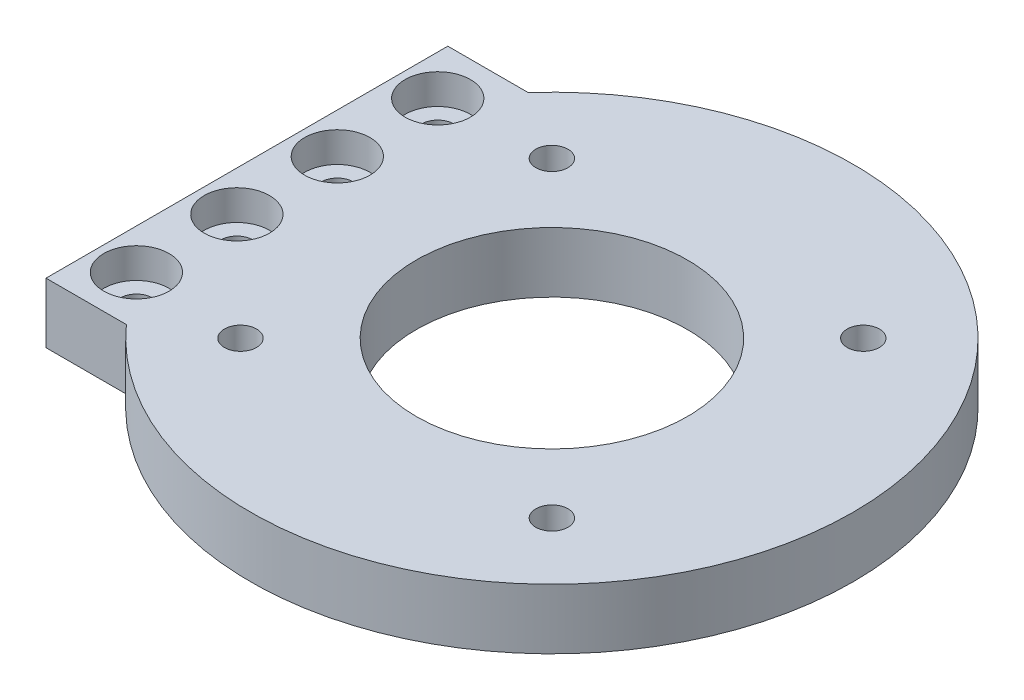
ISO-10303-21;
HEADER;
FILE_DESCRIPTION(('STEP AP214'),'2;1');
FILE_NAME('part.step','',(''),(''),'','','');
FILE_SCHEMA(('AUTOMOTIVE_DESIGN { 1 0 10303 214 1 1 1 1 }'));
ENDSEC;
DATA;
#1=APPLICATION_CONTEXT('core data for automotive mechanical design processes');
#2=APPLICATION_PROTOCOL_DEFINITION('international standard','automotive_design',2000,#1);
#3=PRODUCT_CONTEXT('',#1,'mechanical');
#4=PRODUCT('Part','Part','',(#3));
#5=PRODUCT_RELATED_PRODUCT_CATEGORY('part','',(#4));
#6=PRODUCT_DEFINITION_FORMATION('','',#4);
#7=PRODUCT_DEFINITION_CONTEXT('part definition',#1,'design');
#8=PRODUCT_DEFINITION('design','',#6,#7);
#9=PRODUCT_DEFINITION_SHAPE('','',#8);
#10=(LENGTH_UNIT() NAMED_UNIT(*) SI_UNIT(.MILLI.,.METRE.));
#11=(NAMED_UNIT(*) PLANE_ANGLE_UNIT() SI_UNIT($,.RADIAN.));
#12=(NAMED_UNIT(*) SI_UNIT($,.STERADIAN.) SOLID_ANGLE_UNIT());
#13=UNCERTAINTY_MEASURE_WITH_UNIT(LENGTH_MEASURE(1.E-05),#10,'distance_accuracy_value','');
#14=(GEOMETRIC_REPRESENTATION_CONTEXT(3) GLOBAL_UNCERTAINTY_ASSIGNED_CONTEXT((#13)) GLOBAL_UNIT_ASSIGNED_CONTEXT((#10,
#11,#12)) REPRESENTATION_CONTEXT('',''));
#15=CARTESIAN_POINT('',(0.,0.,0.));
#16=DIRECTION('',(0.,0.,1.));
#17=DIRECTION('',(1.,0.,0.));
#18=AXIS2_PLACEMENT_3D('',#15,#16,#17);
#19=CARTESIAN_POINT('',(-11.3606797749976,0.,-75.));
#20=DIRECTION('',(0.,1.,0.));
#21=DIRECTION('',(0.,0.,1.));
#22=AXIS2_PLACEMENT_3D('',#19,#20,#21);
#23=CYLINDRICAL_SURFACE('',#22,1.6);
#24=CARTESIAN_POINT('',(-11.3606797749976,0.,-75.));
#25=DIRECTION('',(0.,1.,0.));
#26=DIRECTION('',(0.,0.,1.));
#27=AXIS2_PLACEMENT_3D('',#24,#25,#26);
#28=CIRCLE('',#27,1.6);
#29=CARTESIAN_POINT('',(-11.3606797749976,0.,-73.4));
#30=VERTEX_POINT('',#29);
#31=EDGE_CURVE('E109',#30,#30,#28,.T.);
#32=ORIENTED_EDGE('',*,*,#31,.F.);
#33=EDGE_LOOP('',(#32));
#34=FACE_BOUND('',#33,.T.);
#35=CARTESIAN_POINT('',(-11.3606797749976,3.,-75.));
#36=DIRECTION('',(0.,1.,0.));
#37=DIRECTION('',(0.,0.,1.));
#38=AXIS2_PLACEMENT_3D('',#35,#36,#37);
#39=CIRCLE('',#38,1.6);
#40=CARTESIAN_POINT('',(-11.3606797749976,3.,-73.4));
#41=VERTEX_POINT('',#40);
#42=EDGE_CURVE('E44',#41,#41,#39,.F.);
#43=ORIENTED_EDGE('',*,*,#42,.F.);
#44=EDGE_LOOP('',(#43));
#45=FACE_BOUND('',#44,.T.);
#46=ADVANCED_FACE('F40',(#34,#45),#23,.F.);
#47=CARTESIAN_POINT('',(-11.3606797749977,0.,-85.));
#48=DIRECTION('',(0.,1.,0.));
#49=DIRECTION('',(0.,0.,1.));
#50=AXIS2_PLACEMENT_3D('',#47,#48,#49);
#51=CYLINDRICAL_SURFACE('',#50,1.6);
#52=CARTESIAN_POINT('',(-11.3606797749977,0.,-85.));
#53=DIRECTION('',(0.,1.,0.));
#54=DIRECTION('',(0.,0.,1.));
#55=AXIS2_PLACEMENT_3D('',#52,#53,#54);
#56=CIRCLE('',#55,1.6);
#57=CARTESIAN_POINT('',(-11.3606797749977,0.,-83.4));
#58=VERTEX_POINT('',#57);
#59=EDGE_CURVE('E165',#58,#58,#56,.T.);
#60=ORIENTED_EDGE('',*,*,#59,.F.);
#61=EDGE_LOOP('',(#60));
#62=FACE_BOUND('',#61,.T.);
#63=CARTESIAN_POINT('',(-11.3606797749977,3.,-85.));
#64=DIRECTION('',(0.,1.,0.));
#65=DIRECTION('',(0.,0.,1.));
#66=AXIS2_PLACEMENT_3D('',#63,#64,#65);
#67=CIRCLE('',#66,1.6);
#68=CARTESIAN_POINT('',(-11.3606797749977,3.,-83.4));
#69=VERTEX_POINT('',#68);
#70=EDGE_CURVE('E157',#69,#69,#67,.F.);
#71=ORIENTED_EDGE('',*,*,#70,.F.);
#72=EDGE_LOOP('',(#71));
#73=FACE_BOUND('',#72,.T.);
#74=ADVANCED_FACE('F247',(#62,#73),#51,.F.);
#75=CARTESIAN_POINT('',(-11.3606797749978,0.,-95.));
#76=DIRECTION('',(0.,1.,0.));
#77=DIRECTION('',(0.,0.,1.));
#78=AXIS2_PLACEMENT_3D('',#75,#76,#77);
#79=CYLINDRICAL_SURFACE('',#78,1.6);
#80=CARTESIAN_POINT('',(-11.3606797749978,0.,-95.));
#81=DIRECTION('',(0.,1.,0.));
#82=DIRECTION('',(0.,0.,1.));
#83=AXIS2_PLACEMENT_3D('',#80,#81,#82);
#84=CIRCLE('',#83,1.6);
#85=CARTESIAN_POINT('',(-11.3606797749978,0.,-93.4));
#86=VERTEX_POINT('',#85);
#87=EDGE_CURVE('E169',#86,#86,#84,.T.);
#88=ORIENTED_EDGE('',*,*,#87,.F.);
#89=EDGE_LOOP('',(#88));
#90=FACE_BOUND('',#89,.T.);
#91=CARTESIAN_POINT('',(-11.3606797749978,3.,-95.));
#92=DIRECTION('',(0.,1.,0.));
#93=DIRECTION('',(0.,0.,1.));
#94=AXIS2_PLACEMENT_3D('',#91,#92,#93);
#95=CIRCLE('',#94,1.6);
#96=CARTESIAN_POINT('',(-11.3606797749978,3.,-93.4));
#97=VERTEX_POINT('',#96);
#98=EDGE_CURVE('E154',#97,#97,#95,.F.);
#99=ORIENTED_EDGE('',*,*,#98,.F.);
#100=EDGE_LOOP('',(#99));
#101=FACE_BOUND('',#100,.T.);
#102=ADVANCED_FACE('F253',(#90,#101),#79,.F.);
#103=CARTESIAN_POINT('',(-11.3606797749979,0.,-105.));
#104=DIRECTION('',(0.,1.,0.));
#105=DIRECTION('',(0.,0.,1.));
#106=AXIS2_PLACEMENT_3D('',#103,#104,#105);
#107=CYLINDRICAL_SURFACE('',#106,1.6);
#108=CARTESIAN_POINT('',(-11.3606797749979,0.,-105.));
#109=DIRECTION('',(0.,1.,0.));
#110=DIRECTION('',(0.,0.,1.));
#111=AXIS2_PLACEMENT_3D('',#108,#109,#110);
#112=CIRCLE('',#111,1.6);
#113=CARTESIAN_POINT('',(-11.3606797749979,0.,-103.4));
#114=VERTEX_POINT('',#113);
#115=EDGE_CURVE('E115',#114,#114,#112,.T.);
#116=ORIENTED_EDGE('',*,*,#115,.F.);
#117=EDGE_LOOP('',(#116));
#118=FACE_BOUND('',#117,.T.);
#119=CARTESIAN_POINT('',(-11.3606797749979,3.,-105.));
#120=DIRECTION('',(0.,1.,0.));
#121=DIRECTION('',(0.,0.,1.));
#122=AXIS2_PLACEMENT_3D('',#119,#120,#121);
#123=CIRCLE('',#122,1.6);
#124=CARTESIAN_POINT('',(-11.3606797749979,3.,-103.4));
#125=VERTEX_POINT('',#124);
#126=EDGE_CURVE('E151',#125,#125,#123,.F.);
#127=ORIENTED_EDGE('',*,*,#126,.F.);
#128=EDGE_LOOP('',(#127));
#129=FACE_BOUND('',#128,.T.);
#130=ADVANCED_FACE('F292',(#118,#129),#107,.F.);
#131=CARTESIAN_POINT('',(15.,6.,-90.));
#132=DIRECTION('',(0.,-1.,0.));
#133=DIRECTION('',(0.,0.,-1.));
#134=AXIS2_PLACEMENT_3D('',#131,#132,#133);
#135=CYLINDRICAL_SURFACE('',#134,30.);
#136=CARTESIAN_POINT('',(15.,6.,-90.));
#137=DIRECTION('',(0.,1.,0.));
#138=DIRECTION('',(0.,0.,1.));
#139=AXIS2_PLACEMENT_3D('',#136,#137,#138);
#140=CIRCLE('',#139,30.);
#141=CARTESIAN_POINT('',(-7.3606797749979,6.,-70.));
#142=VERTEX_POINT('',#141);
#143=CARTESIAN_POINT('',(-7.3606797749979,6.,-110.));
#144=VERTEX_POINT('',#143);
#145=EDGE_CURVE('E49',#142,#144,#140,.T.);
#146=ORIENTED_EDGE('',*,*,#145,.F.);
#147=DIRECTION('',(0.,1.,0.));
#148=VECTOR('',#147,1.);
#149=CARTESIAN_POINT('',(-7.3606797749979,0.,-70.));
#150=LINE('',#149,#148);
#151=CARTESIAN_POINT('',(-7.3606797749979,0.,-70.));
#152=VERTEX_POINT('',#151);
#153=EDGE_CURVE('E117',#152,#142,#150,.T.);
#154=ORIENTED_EDGE('',*,*,#153,.F.);
#155=CARTESIAN_POINT('',(15.,0.,-90.));
#156=DIRECTION('',(0.,1.,0.));
#157=DIRECTION('',(0.,0.,1.));
#158=AXIS2_PLACEMENT_3D('',#155,#156,#157);
#159=CIRCLE('',#158,30.);
#160=CARTESIAN_POINT('',(-7.3606797749979,0.,-110.));
#161=VERTEX_POINT('',#160);
#162=EDGE_CURVE('E147',#152,#161,#159,.T.);
#163=ORIENTED_EDGE('',*,*,#162,.T.);
#164=DIRECTION('',(0.,1.,0.));
#165=VECTOR('',#164,1.);
#166=CARTESIAN_POINT('',(-7.3606797749979,0.,-110.));
#167=LINE('',#166,#165);
#168=EDGE_CURVE('E88',#161,#144,#167,.T.);
#169=ORIENTED_EDGE('',*,*,#168,.T.);
#170=EDGE_LOOP('',(#146,#154,#163,#169));
#171=FACE_BOUND('',#170,.T.);
#172=ADVANCED_FACE('F294',(#171),#135,.T.);
#173=CARTESIAN_POINT('',(30.5,6.,-105.5));
#174=DIRECTION('',(0.,-1.,0.));
#175=DIRECTION('',(0.,0.,-1.));
#176=AXIS2_PLACEMENT_3D('',#173,#174,#175);
#177=CYLINDRICAL_SURFACE('',#176,1.6);
#178=CARTESIAN_POINT('',(30.5,6.,-105.5));
#179=DIRECTION('',(0.,1.,0.));
#180=DIRECTION('',(0.,0.,1.));
#181=AXIS2_PLACEMENT_3D('',#178,#179,#180);
#182=CIRCLE('',#181,1.6);
#183=CARTESIAN_POINT('',(30.5,6.,-103.9));
#184=VERTEX_POINT('',#183);
#185=EDGE_CURVE('E132',#184,#184,#182,.T.);
#186=ORIENTED_EDGE('',*,*,#185,.T.);
#187=EDGE_LOOP('',(#186));
#188=FACE_BOUND('',#187,.T.);
#189=CARTESIAN_POINT('',(30.5,0.,-105.5));
#190=DIRECTION('',(0.,1.,0.));
#191=DIRECTION('',(0.,0.,1.));
#192=AXIS2_PLACEMENT_3D('',#189,#190,#191);
#193=CIRCLE('',#192,1.6);
#194=CARTESIAN_POINT('',(30.5,0.,-103.9));
#195=VERTEX_POINT('',#194);
#196=EDGE_CURVE('E144',#195,#195,#193,.T.);
#197=ORIENTED_EDGE('',*,*,#196,.F.);
#198=EDGE_LOOP('',(#197));
#199=FACE_BOUND('',#198,.T.);
#200=ADVANCED_FACE('F313',(#188,#199),#177,.F.);
#201=CARTESIAN_POINT('',(-0.500000000000014,6.,-105.5));
#202=DIRECTION('',(0.,-1.,0.));
#203=DIRECTION('',(0.,0.,-1.));
#204=AXIS2_PLACEMENT_3D('',#201,#202,#203);
#205=CYLINDRICAL_SURFACE('',#204,1.6);
#206=CARTESIAN_POINT('',(-0.500000000000014,6.,-105.5));
#207=DIRECTION('',(0.,1.,0.));
#208=DIRECTION('',(0.,0.,1.));
#209=AXIS2_PLACEMENT_3D('',#206,#207,#208);
#210=CIRCLE('',#209,1.6);
#211=CARTESIAN_POINT('',(-0.500000000000014,6.,-103.9));
#212=VERTEX_POINT('',#211);
#213=EDGE_CURVE('E129',#212,#212,#210,.F.);
#214=ORIENTED_EDGE('',*,*,#213,.F.);
#215=EDGE_LOOP('',(#214));
#216=FACE_BOUND('',#215,.T.);
#217=CARTESIAN_POINT('',(-0.500000000000014,0.,-105.5));
#218=DIRECTION('',(0.,1.,0.));
#219=DIRECTION('',(0.,0.,1.));
#220=AXIS2_PLACEMENT_3D('',#217,#218,#219);
#221=CIRCLE('',#220,1.6);
#222=CARTESIAN_POINT('',(-0.500000000000014,0.,-103.9));
#223=VERTEX_POINT('',#222);
#224=EDGE_CURVE('E141',#223,#223,#221,.F.);
#225=ORIENTED_EDGE('',*,*,#224,.T.);
#226=EDGE_LOOP('',(#225));
#227=FACE_BOUND('',#226,.T.);
#228=ADVANCED_FACE('F315',(#216,#227),#205,.F.);
#229=CARTESIAN_POINT('',(-0.500000000000014,6.,-74.5));
#230=DIRECTION('',(0.,-1.,0.));
#231=DIRECTION('',(0.,0.,-1.));
#232=AXIS2_PLACEMENT_3D('',#229,#230,#231);
#233=CYLINDRICAL_SURFACE('',#232,1.6);
#234=CARTESIAN_POINT('',(-0.500000000000014,6.,-74.5));
#235=DIRECTION('',(0.,1.,0.));
#236=DIRECTION('',(0.,0.,1.));
#237=AXIS2_PLACEMENT_3D('',#234,#235,#236);
#238=CIRCLE('',#237,1.6);
#239=CARTESIAN_POINT('',(-0.500000000000014,6.,-72.9));
#240=VERTEX_POINT('',#239);
#241=EDGE_CURVE('E125',#240,#240,#238,.T.);
#242=ORIENTED_EDGE('',*,*,#241,.T.);
#243=EDGE_LOOP('',(#242));
#244=FACE_BOUND('',#243,.T.);
#245=CARTESIAN_POINT('',(-0.500000000000014,0.,-74.5));
#246=DIRECTION('',(0.,1.,0.));
#247=DIRECTION('',(0.,0.,1.));
#248=AXIS2_PLACEMENT_3D('',#245,#246,#247);
#249=CIRCLE('',#248,1.6);
#250=CARTESIAN_POINT('',(-0.500000000000014,0.,-72.9));
#251=VERTEX_POINT('',#250);
#252=EDGE_CURVE('E138',#251,#251,#249,.T.);
#253=ORIENTED_EDGE('',*,*,#252,.F.);
#254=EDGE_LOOP('',(#253));
#255=FACE_BOUND('',#254,.T.);
#256=ADVANCED_FACE('F322',(#244,#255),#233,.F.);
#257=CARTESIAN_POINT('',(15.,6.,-90.));
#258=DIRECTION('',(0.,-1.,0.));
#259=DIRECTION('',(0.,0.,-1.));
#260=AXIS2_PLACEMENT_3D('',#257,#258,#259);
#261=CYLINDRICAL_SURFACE('',#260,13.5);
#262=CARTESIAN_POINT('',(15.,6.,-90.));
#263=DIRECTION('',(0.,1.,0.));
#264=DIRECTION('',(0.,0.,1.));
#265=AXIS2_PLACEMENT_3D('',#262,#263,#264);
#266=CIRCLE('',#265,13.5);
#267=CARTESIAN_POINT('',(15.,6.,-76.5));
#268=VERTEX_POINT('',#267);
#269=EDGE_CURVE('E122',#268,#268,#266,.T.);
#270=ORIENTED_EDGE('',*,*,#269,.T.);
#271=EDGE_LOOP('',(#270));
#272=FACE_BOUND('',#271,.T.);
#273=CARTESIAN_POINT('',(15.,0.,-90.));
#274=DIRECTION('',(0.,1.,0.));
#275=DIRECTION('',(0.,0.,1.));
#276=AXIS2_PLACEMENT_3D('',#273,#274,#275);
#277=CIRCLE('',#276,13.5);
#278=CARTESIAN_POINT('',(15.,0.,-76.5));
#279=VERTEX_POINT('',#278);
#280=EDGE_CURVE('E119',#279,#279,#277,.T.);
#281=ORIENTED_EDGE('',*,*,#280,.F.);
#282=EDGE_LOOP('',(#281));
#283=FACE_BOUND('',#282,.T.);
#284=ADVANCED_FACE('F42',(#272,#283),#261,.F.);
#285=CARTESIAN_POINT('',(30.5,6.,-74.5));
#286=DIRECTION('',(0.,-1.,0.));
#287=DIRECTION('',(0.,0.,-1.));
#288=AXIS2_PLACEMENT_3D('',#285,#286,#287);
#289=CYLINDRICAL_SURFACE('',#288,1.6);
#290=CARTESIAN_POINT('',(30.5,6.,-74.5));
#291=DIRECTION('',(0.,1.,0.));
#292=DIRECTION('',(0.,0.,1.));
#293=AXIS2_PLACEMENT_3D('',#290,#291,#292);
#294=CIRCLE('',#293,1.6);
#295=CARTESIAN_POINT('',(30.5,6.,-72.9));
#296=VERTEX_POINT('',#295);
#297=EDGE_CURVE('E11',#296,#296,#294,.F.);
#298=ORIENTED_EDGE('',*,*,#297,.F.);
#299=EDGE_LOOP('',(#298));
#300=FACE_BOUND('',#299,.T.);
#301=CARTESIAN_POINT('',(30.5,0.,-74.5));
#302=DIRECTION('',(0.,1.,0.));
#303=DIRECTION('',(0.,0.,1.));
#304=AXIS2_PLACEMENT_3D('',#301,#302,#303);
#305=CIRCLE('',#304,1.6);
#306=CARTESIAN_POINT('',(30.5,0.,-72.9));
#307=VERTEX_POINT('',#306);
#308=EDGE_CURVE('E126',#307,#307,#305,.F.);
#309=ORIENTED_EDGE('',*,*,#308,.T.);
#310=EDGE_LOOP('',(#309));
#311=FACE_BOUND('',#310,.T.);
#312=ADVANCED_FACE('F214',(#300,#311),#289,.F.);
#313=CARTESIAN_POINT('',(0.,6.,0.));
#314=DIRECTION('',(0.,1.,0.));
#315=DIRECTION('',(0.,0.,1.));
#316=AXIS2_PLACEMENT_3D('',#313,#314,#315);
#317=PLANE('',#316);
#318=CARTESIAN_POINT('',(-11.3606797749979,6.,-105.));
#319=DIRECTION('',(0.,1.,0.));
#320=DIRECTION('',(0.,0.,1.));
#321=AXIS2_PLACEMENT_3D('',#318,#319,#320);
#322=CIRCLE('',#321,3.25);
#323=CARTESIAN_POINT('',(-11.3606797749979,6.,-101.75));
#324=VERTEX_POINT('',#323);
#325=EDGE_CURVE('E195',#324,#324,#322,.T.);
#326=ORIENTED_EDGE('',*,*,#325,.F.);
#327=EDGE_LOOP('',(#326));
#328=FACE_BOUND('',#327,.T.);
#329=CARTESIAN_POINT('',(-11.3606797749978,6.,-95.));
#330=DIRECTION('',(0.,1.,0.));
#331=DIRECTION('',(0.,0.,1.));
#332=AXIS2_PLACEMENT_3D('',#329,#330,#331);
#333=CIRCLE('',#332,3.25);
#334=CARTESIAN_POINT('',(-11.3606797749978,6.,-91.75));
#335=VERTEX_POINT('',#334);
#336=EDGE_CURVE('E192',#335,#335,#333,.T.);
#337=ORIENTED_EDGE('',*,*,#336,.F.);
#338=EDGE_LOOP('',(#337));
#339=FACE_BOUND('',#338,.T.);
#340=CARTESIAN_POINT('',(-11.3606797749977,6.,-85.));
#341=DIRECTION('',(0.,1.,0.));
#342=DIRECTION('',(0.,0.,1.));
#343=AXIS2_PLACEMENT_3D('',#340,#341,#342);
#344=CIRCLE('',#343,3.25);
#345=CARTESIAN_POINT('',(-11.3606797749977,6.,-81.75));
#346=VERTEX_POINT('',#345);
#347=EDGE_CURVE('E186',#346,#346,#344,.T.);
#348=ORIENTED_EDGE('',*,*,#347,.F.);
#349=EDGE_LOOP('',(#348));
#350=FACE_BOUND('',#349,.T.);
#351=CARTESIAN_POINT('',(-11.3606797749976,6.,-75.));
#352=DIRECTION('',(0.,1.,0.));
#353=DIRECTION('',(0.,0.,1.));
#354=AXIS2_PLACEMENT_3D('',#351,#352,#353);
#355=CIRCLE('',#354,3.25);
#356=CARTESIAN_POINT('',(-11.3606797749976,6.,-71.75));
#357=VERTEX_POINT('',#356);
#358=EDGE_CURVE('E180',#357,#357,#355,.T.);
#359=ORIENTED_EDGE('',*,*,#358,.F.);
#360=EDGE_LOOP('',(#359));
#361=FACE_BOUND('',#360,.T.);
#362=ORIENTED_EDGE('',*,*,#145,.T.);
#363=DIRECTION('',(-1.,0.,0.));
#364=VECTOR('',#363,1.);
#365=CARTESIAN_POINT('',(-7.3606797749979,6.,-110.));
#366=LINE('',#365,#364);
#367=CARTESIAN_POINT('',(-15.3606797749979,6.,-110.));
#368=VERTEX_POINT('',#367);
#369=EDGE_CURVE('E113',#144,#368,#366,.T.);
#370=ORIENTED_EDGE('',*,*,#369,.T.);
#371=DIRECTION('',(0.,0.,1.));
#372=VECTOR('',#371,1.);
#373=CARTESIAN_POINT('',(-15.3606797749979,6.,-70.));
#374=LINE('',#373,#372);
#375=CARTESIAN_POINT('',(-15.3606797749979,6.,-70.));
#376=VERTEX_POINT('',#375);
#377=EDGE_CURVE('E95',#368,#376,#374,.T.);
#378=ORIENTED_EDGE('',*,*,#377,.T.);
#379=DIRECTION('',(1.,0.,0.));
#380=VECTOR('',#379,1.);
#381=CARTESIAN_POINT('',(-7.3606797749979,6.,-70.));
#382=LINE('',#381,#380);
#383=EDGE_CURVE('E57',#376,#142,#382,.T.);
#384=ORIENTED_EDGE('',*,*,#383,.T.);
#385=EDGE_LOOP('',(#362,#370,#378,#384));
#386=FACE_BOUND('',#385,.T.);
#387=ORIENTED_EDGE('',*,*,#269,.F.);
#388=EDGE_LOOP('',(#387));
#389=FACE_BOUND('',#388,.T.);
#390=ORIENTED_EDGE('',*,*,#241,.F.);
#391=EDGE_LOOP('',(#390));
#392=FACE_BOUND('',#391,.T.);
#393=ORIENTED_EDGE('',*,*,#213,.T.);
#394=EDGE_LOOP('',(#393));
#395=FACE_BOUND('',#394,.T.);
#396=ORIENTED_EDGE('',*,*,#185,.F.);
#397=EDGE_LOOP('',(#396));
#398=FACE_BOUND('',#397,.T.);
#399=ORIENTED_EDGE('',*,*,#297,.T.);
#400=EDGE_LOOP('',(#399));
#401=FACE_BOUND('',#400,.T.);
#402=ADVANCED_FACE('F211',(#328,#339,#350,#361,#386,#389,#392,#395,#398,#401),#317,.T.);
#403=CARTESIAN_POINT('',(0.,0.,0.));
#404=DIRECTION('',(0.,1.,0.));
#405=DIRECTION('',(0.,0.,1.));
#406=AXIS2_PLACEMENT_3D('',#403,#404,#405);
#407=PLANE('',#406);
#408=ORIENTED_EDGE('',*,*,#115,.T.);
#409=EDGE_LOOP('',(#408));
#410=FACE_BOUND('',#409,.T.);
#411=ORIENTED_EDGE('',*,*,#87,.T.);
#412=EDGE_LOOP('',(#411));
#413=FACE_BOUND('',#412,.T.);
#414=ORIENTED_EDGE('',*,*,#59,.T.);
#415=EDGE_LOOP('',(#414));
#416=FACE_BOUND('',#415,.T.);
#417=ORIENTED_EDGE('',*,*,#31,.T.);
#418=EDGE_LOOP('',(#417));
#419=FACE_BOUND('',#418,.T.);
#420=ORIENTED_EDGE('',*,*,#280,.T.);
#421=EDGE_LOOP('',(#420));
#422=FACE_BOUND('',#421,.T.);
#423=ORIENTED_EDGE('',*,*,#252,.T.);
#424=EDGE_LOOP('',(#423));
#425=FACE_BOUND('',#424,.T.);
#426=ORIENTED_EDGE('',*,*,#224,.F.);
#427=EDGE_LOOP('',(#426));
#428=FACE_BOUND('',#427,.T.);
#429=ORIENTED_EDGE('',*,*,#196,.T.);
#430=EDGE_LOOP('',(#429));
#431=FACE_BOUND('',#430,.T.);
#432=ORIENTED_EDGE('',*,*,#162,.F.);
#433=DIRECTION('',(1.,0.,0.));
#434=VECTOR('',#433,1.);
#435=CARTESIAN_POINT('',(-7.3606797749979,0.,-70.));
#436=LINE('',#435,#434);
#437=CARTESIAN_POINT('',(-15.3606797749979,0.,-70.));
#438=VERTEX_POINT('',#437);
#439=EDGE_CURVE('E65',#438,#152,#436,.T.);
#440=ORIENTED_EDGE('',*,*,#439,.F.);
#441=DIRECTION('',(0.,0.,1.));
#442=VECTOR('',#441,1.);
#443=CARTESIAN_POINT('',(-15.3606797749979,0.,-70.));
#444=LINE('',#443,#442);
#445=CARTESIAN_POINT('',(-15.3606797749979,0.,-110.));
#446=VERTEX_POINT('',#445);
#447=EDGE_CURVE('E94',#446,#438,#444,.T.);
#448=ORIENTED_EDGE('',*,*,#447,.F.);
#449=DIRECTION('',(-1.,0.,0.));
#450=VECTOR('',#449,1.);
#451=CARTESIAN_POINT('',(-7.3606797749979,0.,-110.));
#452=LINE('',#451,#450);
#453=EDGE_CURVE('E102',#161,#446,#452,.T.);
#454=ORIENTED_EDGE('',*,*,#453,.F.);
#455=EDGE_LOOP('',(#432,#440,#448,#454));
#456=FACE_BOUND('',#455,.T.);
#457=ORIENTED_EDGE('',*,*,#308,.F.);
#458=EDGE_LOOP('',(#457));
#459=FACE_BOUND('',#458,.T.);
#460=ADVANCED_FACE('F100',(#410,#413,#416,#419,#422,#425,#428,#431,#456,#459),#407,.F.);
#461=CARTESIAN_POINT('',(-7.3606797749979,0.,-70.));
#462=DIRECTION('',(0.,0.,1.));
#463=DIRECTION('',(1.,0.,0.));
#464=AXIS2_PLACEMENT_3D('',#461,#462,#463);
#465=PLANE('',#464);
#466=ORIENTED_EDGE('',*,*,#383,.F.);
#467=DIRECTION('',(0.,1.,0.));
#468=VECTOR('',#467,1.);
#469=CARTESIAN_POINT('',(-15.3606797749979,0.,-70.));
#470=LINE('',#469,#468);
#471=EDGE_CURVE('E82',#438,#376,#470,.T.);
#472=ORIENTED_EDGE('',*,*,#471,.F.);
#473=ORIENTED_EDGE('',*,*,#439,.T.);
#474=ORIENTED_EDGE('',*,*,#153,.T.);
#475=EDGE_LOOP('',(#466,#472,#473,#474));
#476=FACE_BOUND('',#475,.T.);
#477=ADVANCED_FACE('F238',(#476),#465,.T.);
#478=CARTESIAN_POINT('',(-15.3606797749979,0.,-70.));
#479=DIRECTION('',(-1.,0.,0.));
#480=DIRECTION('',(0.,0.,1.));
#481=AXIS2_PLACEMENT_3D('',#478,#479,#480);
#482=PLANE('',#481);
#483=ORIENTED_EDGE('',*,*,#377,.F.);
#484=DIRECTION('',(0.,1.,0.));
#485=VECTOR('',#484,1.);
#486=CARTESIAN_POINT('',(-15.3606797749979,0.,-110.));
#487=LINE('',#486,#485);
#488=EDGE_CURVE('E91',#446,#368,#487,.T.);
#489=ORIENTED_EDGE('',*,*,#488,.F.);
#490=ORIENTED_EDGE('',*,*,#447,.T.);
#491=ORIENTED_EDGE('',*,*,#471,.T.);
#492=EDGE_LOOP('',(#483,#489,#490,#491));
#493=FACE_BOUND('',#492,.T.);
#494=ADVANCED_FACE('F93',(#493),#482,.T.);
#495=CARTESIAN_POINT('',(-7.3606797749979,0.,-110.));
#496=DIRECTION('',(0.,0.,-1.));
#497=DIRECTION('',(-1.,0.,0.));
#498=AXIS2_PLACEMENT_3D('',#495,#496,#497);
#499=PLANE('',#498);
#500=ORIENTED_EDGE('',*,*,#369,.F.);
#501=ORIENTED_EDGE('',*,*,#168,.F.);
#502=ORIENTED_EDGE('',*,*,#453,.T.);
#503=ORIENTED_EDGE('',*,*,#488,.T.);
#504=EDGE_LOOP('',(#500,#501,#502,#503));
#505=FACE_BOUND('',#504,.T.);
#506=ADVANCED_FACE('F105',(#505),#499,.T.);
#507=CARTESIAN_POINT('',(-11.3606797749979,3.,-105.));
#508=DIRECTION('',(0.,1.,0.));
#509=DIRECTION('',(0.,0.,1.));
#510=AXIS2_PLACEMENT_3D('',#507,#508,#509);
#511=PLANE('',#510);
#512=CARTESIAN_POINT('',(-11.3606797749979,3.,-105.));
#513=DIRECTION('',(0.,1.,0.));
#514=DIRECTION('',(0.,0.,1.));
#515=AXIS2_PLACEMENT_3D('',#512,#513,#514);
#516=CIRCLE('',#515,3.25);
#517=CARTESIAN_POINT('',(-11.3606797749979,3.,-101.75));
#518=VERTEX_POINT('',#517);
#519=EDGE_CURVE('E155',#518,#518,#516,.T.);
#520=ORIENTED_EDGE('',*,*,#519,.T.);
#521=EDGE_LOOP('',(#520));
#522=FACE_BOUND('',#521,.T.);
#523=ORIENTED_EDGE('',*,*,#126,.T.);
#524=EDGE_LOOP('',(#523));
#525=FACE_BOUND('',#524,.T.);
#526=ADVANCED_FACE('F201',(#522,#525),#511,.T.);
#527=CARTESIAN_POINT('',(-11.3606797749979,3.,-105.));
#528=DIRECTION('',(0.,1.,0.));
#529=DIRECTION('',(0.,0.,1.));
#530=AXIS2_PLACEMENT_3D('',#527,#528,#529);
#531=CYLINDRICAL_SURFACE('',#530,3.25);
#532=ORIENTED_EDGE('',*,*,#519,.F.);
#533=EDGE_LOOP('',(#532));
#534=FACE_BOUND('',#533,.T.);
#535=ORIENTED_EDGE('',*,*,#325,.T.);
#536=EDGE_LOOP('',(#535));
#537=FACE_BOUND('',#536,.T.);
#538=ADVANCED_FACE('F204',(#534,#537),#531,.F.);
#539=CARTESIAN_POINT('',(-11.3606797749978,3.,-95.));
#540=DIRECTION('',(0.,1.,0.));
#541=DIRECTION('',(0.,0.,1.));
#542=AXIS2_PLACEMENT_3D('',#539,#540,#541);
#543=PLANE('',#542);
#544=CARTESIAN_POINT('',(-11.3606797749978,3.,-95.));
#545=DIRECTION('',(0.,1.,0.));
#546=DIRECTION('',(0.,0.,1.));
#547=AXIS2_PLACEMENT_3D('',#544,#545,#546);
#548=CIRCLE('',#547,3.25);
#549=CARTESIAN_POINT('',(-11.3606797749978,3.,-91.75));
#550=VERTEX_POINT('',#549);
#551=EDGE_CURVE('E189',#550,#550,#548,.T.);
#552=ORIENTED_EDGE('',*,*,#551,.T.);
#553=EDGE_LOOP('',(#552));
#554=FACE_BOUND('',#553,.T.);
#555=ORIENTED_EDGE('',*,*,#98,.T.);
#556=EDGE_LOOP('',(#555));
#557=FACE_BOUND('',#556,.T.);
#558=ADVANCED_FACE('F207',(#554,#557),#543,.T.);
#559=CARTESIAN_POINT('',(-11.3606797749978,3.,-95.));
#560=DIRECTION('',(0.,1.,0.));
#561=DIRECTION('',(0.,0.,1.));
#562=AXIS2_PLACEMENT_3D('',#559,#560,#561);
#563=CYLINDRICAL_SURFACE('',#562,3.25);
#564=ORIENTED_EDGE('',*,*,#551,.F.);
#565=EDGE_LOOP('',(#564));
#566=FACE_BOUND('',#565,.T.);
#567=ORIENTED_EDGE('',*,*,#336,.T.);
#568=EDGE_LOOP('',(#567));
#569=FACE_BOUND('',#568,.T.);
#570=ADVANCED_FACE('F269',(#566,#569),#563,.F.);
#571=CARTESIAN_POINT('',(-11.3606797749977,3.,-85.));
#572=DIRECTION('',(0.,1.,0.));
#573=DIRECTION('',(0.,0.,1.));
#574=AXIS2_PLACEMENT_3D('',#571,#572,#573);
#575=PLANE('',#574);
#576=CARTESIAN_POINT('',(-11.3606797749977,3.,-85.));
#577=DIRECTION('',(0.,1.,0.));
#578=DIRECTION('',(0.,0.,1.));
#579=AXIS2_PLACEMENT_3D('',#576,#577,#578);
#580=CIRCLE('',#579,3.25);
#581=CARTESIAN_POINT('',(-11.3606797749977,3.,-81.75));
#582=VERTEX_POINT('',#581);
#583=EDGE_CURVE('E183',#582,#582,#580,.T.);
#584=ORIENTED_EDGE('',*,*,#583,.T.);
#585=EDGE_LOOP('',(#584));
#586=FACE_BOUND('',#585,.T.);
#587=ORIENTED_EDGE('',*,*,#70,.T.);
#588=EDGE_LOOP('',(#587));
#589=FACE_BOUND('',#588,.T.);
#590=ADVANCED_FACE('F272',(#586,#589),#575,.T.);
#591=CARTESIAN_POINT('',(-11.3606797749977,3.,-85.));
#592=DIRECTION('',(0.,1.,0.));
#593=DIRECTION('',(0.,0.,1.));
#594=AXIS2_PLACEMENT_3D('',#591,#592,#593);
#595=CYLINDRICAL_SURFACE('',#594,3.25);
#596=ORIENTED_EDGE('',*,*,#583,.F.);
#597=EDGE_LOOP('',(#596));
#598=FACE_BOUND('',#597,.T.);
#599=ORIENTED_EDGE('',*,*,#347,.T.);
#600=EDGE_LOOP('',(#599));
#601=FACE_BOUND('',#600,.T.);
#602=ADVANCED_FACE('F277',(#598,#601),#595,.F.);
#603=CARTESIAN_POINT('',(-11.3606797749976,3.,-75.));
#604=DIRECTION('',(0.,1.,0.));
#605=DIRECTION('',(0.,0.,1.));
#606=AXIS2_PLACEMENT_3D('',#603,#604,#605);
#607=PLANE('',#606);
#608=CARTESIAN_POINT('',(-11.3606797749976,3.,-75.));
#609=DIRECTION('',(0.,1.,0.));
#610=DIRECTION('',(0.,0.,1.));
#611=AXIS2_PLACEMENT_3D('',#608,#609,#610);
#612=CIRCLE('',#611,3.25);
#613=CARTESIAN_POINT('',(-11.3606797749976,3.,-71.75));
#614=VERTEX_POINT('',#613);
#615=EDGE_CURVE('E177',#614,#614,#612,.T.);
#616=ORIENTED_EDGE('',*,*,#615,.T.);
#617=EDGE_LOOP('',(#616));
#618=FACE_BOUND('',#617,.T.);
#619=ORIENTED_EDGE('',*,*,#42,.T.);
#620=EDGE_LOOP('',(#619));
#621=FACE_BOUND('',#620,.T.);
#622=ADVANCED_FACE('F280',(#618,#621),#607,.T.);
#623=CARTESIAN_POINT('',(-11.3606797749976,3.,-75.));
#624=DIRECTION('',(0.,1.,0.));
#625=DIRECTION('',(0.,0.,1.));
#626=AXIS2_PLACEMENT_3D('',#623,#624,#625);
#627=CYLINDRICAL_SURFACE('',#626,3.25);
#628=ORIENTED_EDGE('',*,*,#615,.F.);
#629=EDGE_LOOP('',(#628));
#630=FACE_BOUND('',#629,.T.);
#631=ORIENTED_EDGE('',*,*,#358,.T.);
#632=EDGE_LOOP('',(#631));
#633=FACE_BOUND('',#632,.T.);
#634=ADVANCED_FACE('F285',(#630,#633),#627,.F.);
#635=CLOSED_SHELL('',(#46,#74,#102,#130,#172,#200,#228,#256,#284,#312,#402,#460,#477,#494,#506,
#526,#538,#558,#570,#590,#602,#622,#634));
#636=MANIFOLD_SOLID_BREP('B2',#635);
#637=ADVANCED_BREP_SHAPE_REPRESENTATION('',(#18,#636),#14);
#638=SHAPE_DEFINITION_REPRESENTATION(#9,#637);
ENDSEC;
END-ISO-10303-21;
